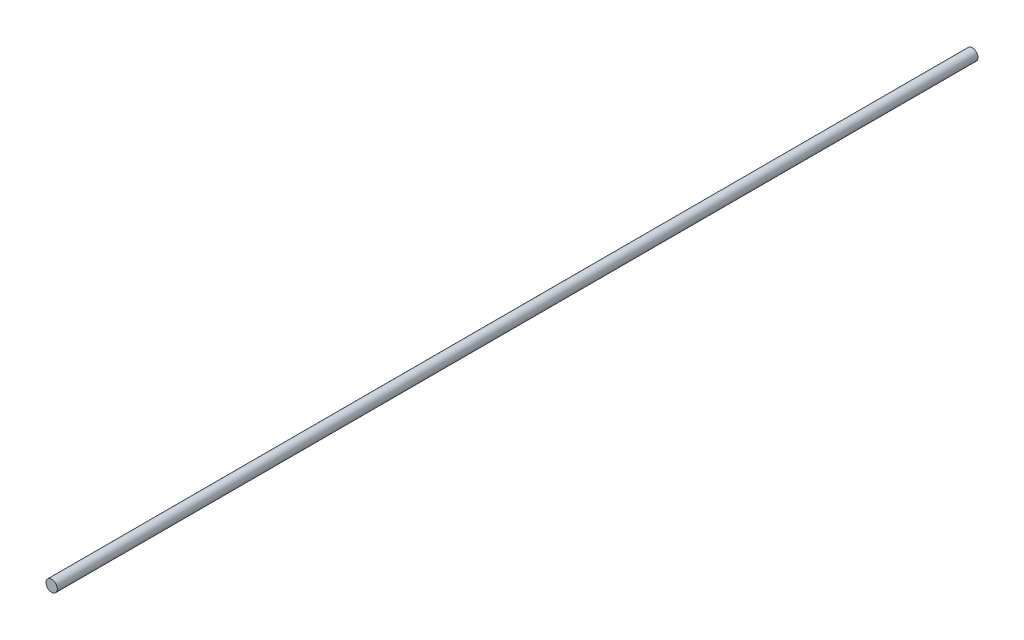
ISO-10303-21;
HEADER;
FILE_DESCRIPTION(('STEP AP214'),'2;1');
FILE_NAME('part.step','',(''),(''),'','','');
FILE_SCHEMA(('AUTOMOTIVE_DESIGN { 1 0 10303 214 1 1 1 1 }'));
ENDSEC;
DATA;
#1=APPLICATION_CONTEXT('core data for automotive mechanical design processes');
#2=APPLICATION_PROTOCOL_DEFINITION('international standard','automotive_design',2000,#1);
#3=PRODUCT_CONTEXT('',#1,'mechanical');
#4=PRODUCT('Part','Part','',(#3));
#5=PRODUCT_RELATED_PRODUCT_CATEGORY('part','',(#4));
#6=PRODUCT_DEFINITION_FORMATION('','',#4);
#7=PRODUCT_DEFINITION_CONTEXT('part definition',#1,'design');
#8=PRODUCT_DEFINITION('design','',#6,#7);
#9=PRODUCT_DEFINITION_SHAPE('','',#8);
#10=(LENGTH_UNIT() NAMED_UNIT(*) SI_UNIT(.MILLI.,.METRE.));
#11=(NAMED_UNIT(*) PLANE_ANGLE_UNIT() SI_UNIT($,.RADIAN.));
#12=(NAMED_UNIT(*) SI_UNIT($,.STERADIAN.) SOLID_ANGLE_UNIT());
#13=UNCERTAINTY_MEASURE_WITH_UNIT(LENGTH_MEASURE(1.E-05),#10,'distance_accuracy_value','');
#14=(GEOMETRIC_REPRESENTATION_CONTEXT(3) GLOBAL_UNCERTAINTY_ASSIGNED_CONTEXT((#13)) GLOBAL_UNIT_ASSIGNED_CONTEXT((#10,
#11,#12)) REPRESENTATION_CONTEXT('',''));
#15=CARTESIAN_POINT('',(0.,0.,0.));
#16=DIRECTION('',(0.,0.,1.));
#17=DIRECTION('',(1.,0.,0.));
#18=AXIS2_PLACEMENT_3D('',#15,#16,#17);
#19=CARTESIAN_POINT('',(0.,0.,325.));
#20=DIRECTION('',(0.,0.,-1.));
#21=DIRECTION('',(-1.,0.,0.));
#22=AXIS2_PLACEMENT_3D('',#19,#20,#21);
#23=CYLINDRICAL_SURFACE('',#22,4.);
#24=CARTESIAN_POINT('',(0.,0.,325.));
#25=DIRECTION('',(0.,0.,1.));
#26=DIRECTION('',(1.,0.,0.));
#27=AXIS2_PLACEMENT_3D('',#24,#25,#26);
#28=CIRCLE('',#27,4.);
#29=CARTESIAN_POINT('',(4.,0.,325.));
#30=VERTEX_POINT('',#29);
#31=EDGE_CURVE('E10',#30,#30,#28,.T.);
#32=ORIENTED_EDGE('',*,*,#31,.F.);
#33=EDGE_LOOP('',(#32));
#34=FACE_BOUND('',#33,.T.);
#35=CARTESIAN_POINT('',(0.,0.,-325.));
#36=DIRECTION('',(0.,0.,1.));
#37=DIRECTION('',(1.,0.,0.));
#38=AXIS2_PLACEMENT_3D('',#35,#36,#37);
#39=CIRCLE('',#38,4.);
#40=CARTESIAN_POINT('',(4.,0.,-325.));
#41=VERTEX_POINT('',#40);
#42=EDGE_CURVE('E34',#41,#41,#39,.T.);
#43=ORIENTED_EDGE('',*,*,#42,.T.);
#44=EDGE_LOOP('',(#43));
#45=FACE_BOUND('',#44,.T.);
#46=ADVANCED_FACE('F31',(#34,#45),#23,.T.);
#47=CARTESIAN_POINT('',(0.,0.,325.));
#48=DIRECTION('',(0.,0.,1.));
#49=DIRECTION('',(1.,0.,0.));
#50=AXIS2_PLACEMENT_3D('',#47,#48,#49);
#51=PLANE('',#50);
#52=ORIENTED_EDGE('',*,*,#31,.T.);
#53=EDGE_LOOP('',(#52));
#54=FACE_BOUND('',#53,.T.);
#55=ADVANCED_FACE('F46',(#54),#51,.T.);
#56=CARTESIAN_POINT('',(0.,0.,-325.));
#57=DIRECTION('',(0.,0.,1.));
#58=DIRECTION('',(1.,0.,0.));
#59=AXIS2_PLACEMENT_3D('',#56,#57,#58);
#60=PLANE('',#59);
#61=ORIENTED_EDGE('',*,*,#42,.F.);
#62=EDGE_LOOP('',(#61));
#63=FACE_BOUND('',#62,.T.);
#64=ADVANCED_FACE('F44',(#63),#60,.F.);
#65=CLOSED_SHELL('',(#46,#55,#64));
#66=MANIFOLD_SOLID_BREP('B2',#65);
#67=ADVANCED_BREP_SHAPE_REPRESENTATION('',(#18,#66),#14);
#68=SHAPE_DEFINITION_REPRESENTATION(#9,#67);
ENDSEC;
END-ISO-10303-21;
